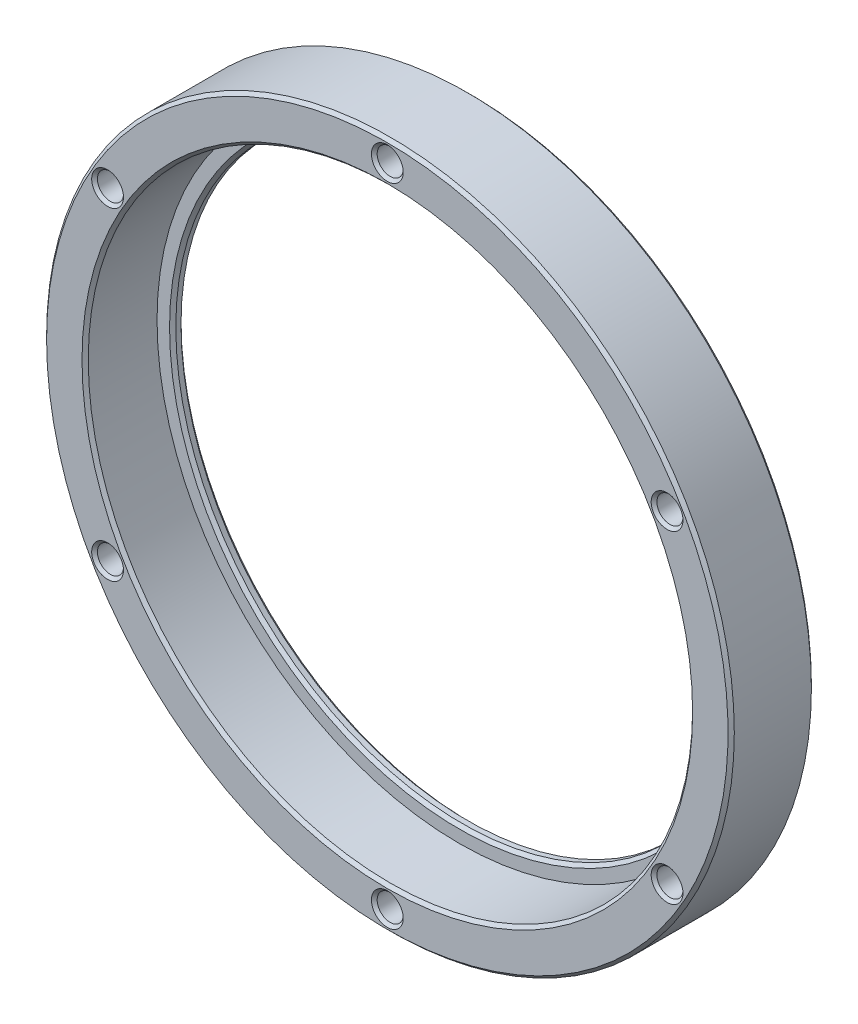
ISO-10303-21;
HEADER;
FILE_DESCRIPTION(('STEP AP214'),'2;1');
FILE_NAME('part.step','',(''),(''),'','','');
FILE_SCHEMA(('AUTOMOTIVE_DESIGN { 1 0 10303 214 1 1 1 1 }'));
ENDSEC;
DATA;
#1=APPLICATION_CONTEXT('core data for automotive mechanical design processes');
#2=APPLICATION_PROTOCOL_DEFINITION('international standard','automotive_design',2000,#1);
#3=PRODUCT_CONTEXT('',#1,'mechanical');
#4=PRODUCT('Part','Part','',(#3));
#5=PRODUCT_RELATED_PRODUCT_CATEGORY('part','',(#4));
#6=PRODUCT_DEFINITION_FORMATION('','',#4);
#7=PRODUCT_DEFINITION_CONTEXT('part definition',#1,'design');
#8=PRODUCT_DEFINITION('design','',#6,#7);
#9=PRODUCT_DEFINITION_SHAPE('','',#8);
#10=(LENGTH_UNIT() NAMED_UNIT(*) SI_UNIT(.MILLI.,.METRE.));
#11=(NAMED_UNIT(*) PLANE_ANGLE_UNIT() SI_UNIT($,.RADIAN.));
#12=(NAMED_UNIT(*) SI_UNIT($,.STERADIAN.) SOLID_ANGLE_UNIT());
#13=UNCERTAINTY_MEASURE_WITH_UNIT(LENGTH_MEASURE(1.E-05),#10,'distance_accuracy_value','');
#14=(GEOMETRIC_REPRESENTATION_CONTEXT(3) GLOBAL_UNCERTAINTY_ASSIGNED_CONTEXT((#13)) GLOBAL_UNIT_ASSIGNED_CONTEXT((#10,
#11,#12)) REPRESENTATION_CONTEXT('',''));
#15=CARTESIAN_POINT('',(0.,0.,0.));
#16=DIRECTION('',(0.,0.,1.));
#17=DIRECTION('',(1.,0.,0.));
#18=AXIS2_PLACEMENT_3D('',#15,#16,#17);
#19=CARTESIAN_POINT('',(33.,0.,8.));
#20=DIRECTION('',(0.,0.,-1.));
#21=DIRECTION('',(-1.,0.,0.));
#22=AXIS2_PLACEMENT_3D('',#19,#20,#21);
#23=PLANE('',#22);
#24=CARTESIAN_POINT('',(0.,0.,8.));
#25=DIRECTION('',(0.,0.,-1.));
#26=DIRECTION('',(-1.,0.,0.));
#27=AXIS2_PLACEMENT_3D('',#24,#25,#26);
#28=CIRCLE('',#27,32.7);
#29=CARTESIAN_POINT('',(-32.7,0.,8.00000000000001));
#30=VERTEX_POINT('',#29);
#31=EDGE_CURVE('E55',#30,#30,#28,.F.);
#32=ORIENTED_EDGE('',*,*,#31,.T.);
#33=EDGE_LOOP('',(#32));
#34=FACE_BOUND('',#33,.T.);
#35=CARTESIAN_POINT('',(0.,0.,8.));
#36=DIRECTION('',(0.,0.,-1.));
#37=DIRECTION('',(-1.,0.,0.));
#38=AXIS2_PLACEMENT_3D('',#35,#36,#37);
#39=CIRCLE('',#38,29.3);
#40=CARTESIAN_POINT('',(-29.3,0.,8.00000000000001));
#41=VERTEX_POINT('',#40);
#42=EDGE_CURVE('E59',#41,#41,#39,.T.);
#43=ORIENTED_EDGE('',*,*,#42,.T.);
#44=EDGE_LOOP('',(#43));
#45=FACE_BOUND('',#44,.T.);
#46=CARTESIAN_POINT('',(-26.8467875173174,15.5000000000003,8.00000000000001));
#47=DIRECTION('',(0.,0.,1.));
#48=DIRECTION('',(0.,-1.,0.));
#49=AXIS2_PLACEMENT_3D('',#46,#47,#48);
#50=CIRCLE('',#49,1.525);
#51=CARTESIAN_POINT('',(-26.8467875173174,13.9750000000003,8.00000000000001));
#52=VERTEX_POINT('',#51);
#53=EDGE_CURVE('E155',#52,#52,#50,.T.);
#54=ORIENTED_EDGE('',*,*,#53,.F.);
#55=EDGE_LOOP('',(#54));
#56=FACE_BOUND('',#55,.T.);
#57=CARTESIAN_POINT('',(-26.8467875173177,-15.4999999999997,8.00000000000001));
#58=DIRECTION('',(0.,0.,1.));
#59=DIRECTION('',(0.,-1.,0.));
#60=AXIS2_PLACEMENT_3D('',#57,#58,#59);
#61=CIRCLE('',#60,1.525);
#62=CARTESIAN_POINT('',(-26.8467875173177,-17.0249999999997,8.00000000000001));
#63=VERTEX_POINT('',#62);
#64=EDGE_CURVE('E143',#63,#63,#61,.T.);
#65=ORIENTED_EDGE('',*,*,#64,.F.);
#66=EDGE_LOOP('',(#65));
#67=FACE_BOUND('',#66,.T.);
#68=CARTESIAN_POINT('',(26.8467875173175,-15.5000000000001,8.));
#69=DIRECTION('',(0.,0.,1.));
#70=DIRECTION('',(0.,-1.,0.));
#71=AXIS2_PLACEMENT_3D('',#68,#69,#70);
#72=CIRCLE('',#71,1.525);
#73=CARTESIAN_POINT('',(26.8467875173175,-17.0250000000001,8.));
#74=VERTEX_POINT('',#73);
#75=EDGE_CURVE('E119',#74,#74,#72,.T.);
#76=ORIENTED_EDGE('',*,*,#75,.F.);
#77=EDGE_LOOP('',(#76));
#78=FACE_BOUND('',#77,.T.);
#79=CARTESIAN_POINT('',(26.8467875173176,15.4999999999999,8.));
#80=DIRECTION('',(0.,0.,1.));
#81=DIRECTION('',(0.,-1.,0.));
#82=AXIS2_PLACEMENT_3D('',#79,#80,#81);
#83=CIRCLE('',#82,1.525);
#84=CARTESIAN_POINT('',(26.8467875173176,13.9749999999999,8.));
#85=VERTEX_POINT('',#84);
#86=EDGE_CURVE('E107',#85,#85,#83,.T.);
#87=ORIENTED_EDGE('',*,*,#86,.F.);
#88=EDGE_LOOP('',(#87));
#89=FACE_BOUND('',#88,.T.);
#90=CARTESIAN_POINT('',(0.,31.,8.));
#91=DIRECTION('',(0.,0.,1.));
#92=DIRECTION('',(1.,0.,0.));
#93=AXIS2_PLACEMENT_3D('',#90,#91,#92);
#94=CIRCLE('',#93,1.525);
#95=CARTESIAN_POINT('',(1.525,31.,8.));
#96=VERTEX_POINT('',#95);
#97=EDGE_CURVE('E95',#96,#96,#94,.T.);
#98=ORIENTED_EDGE('',*,*,#97,.F.);
#99=EDGE_LOOP('',(#98));
#100=FACE_BOUND('',#99,.T.);
#101=CARTESIAN_POINT('',(0.,-31.,8.));
#102=DIRECTION('',(0.,0.,1.));
#103=DIRECTION('',(1.,0.,0.));
#104=AXIS2_PLACEMENT_3D('',#101,#102,#103);
#105=CIRCLE('',#104,1.525);
#106=CARTESIAN_POINT('',(1.525,-31.,8.));
#107=VERTEX_POINT('',#106);
#108=EDGE_CURVE('E131',#107,#107,#105,.T.);
#109=ORIENTED_EDGE('',*,*,#108,.F.);
#110=EDGE_LOOP('',(#109));
#111=FACE_BOUND('',#110,.T.);
#112=ADVANCED_FACE('F47',(#34,#45,#56,#67,#78,#89,#100,#111),#23,.F.);
#113=CARTESIAN_POINT('',(0.,0.,0.));
#114=DIRECTION('',(0.,0.,-1.));
#115=DIRECTION('',(-1.,0.,0.));
#116=AXIS2_PLACEMENT_3D('',#113,#114,#115);
#117=CYLINDRICAL_SURFACE('',#116,27.5000000000054);
#118=CARTESIAN_POINT('',(0.,0.,0.300000000005344));
#119=DIRECTION('',(0.,0.,1.));
#120=DIRECTION('',(1.,0.,0.));
#121=AXIS2_PLACEMENT_3D('',#118,#119,#120);
#122=CIRCLE('',#121,27.5000000000054);
#123=CARTESIAN_POINT('',(27.5000000000054,0.,0.300000000005341));
#124=VERTEX_POINT('',#123);
#125=EDGE_CURVE('E80',#124,#124,#122,.F.);
#126=ORIENTED_EDGE('',*,*,#125,.T.);
#127=EDGE_LOOP('',(#126));
#128=FACE_BOUND('',#127,.T.);
#129=CARTESIAN_POINT('',(0.,0.,0.800000000005345));
#130=DIRECTION('',(0.,0.,-1.));
#131=DIRECTION('',(-1.,0.,0.));
#132=AXIS2_PLACEMENT_3D('',#129,#130,#131);
#133=CIRCLE('',#132,27.5000000000054);
#134=CARTESIAN_POINT('',(-27.5000000000054,0.,0.800000000005348));
#135=VERTEX_POINT('',#134);
#136=EDGE_CURVE('E83',#135,#135,#133,.F.);
#137=ORIENTED_EDGE('',*,*,#136,.T.);
#138=EDGE_LOOP('',(#137));
#139=FACE_BOUND('',#138,.T.);
#140=ADVANCED_FACE('F187',(#128,#139),#117,.F.);
#141=CARTESIAN_POINT('',(27.5000000000107,0.,0.));
#142=DIRECTION('',(0.,0.,1.));
#143=DIRECTION('',(1.,0.,0.));
#144=AXIS2_PLACEMENT_3D('',#141,#142,#143);
#145=PLANE('',#144);
#146=CARTESIAN_POINT('',(0.,0.,0.));
#147=DIRECTION('',(0.,0.,1.));
#148=DIRECTION('',(1.,0.,0.));
#149=AXIS2_PLACEMENT_3D('',#146,#147,#148);
#150=CIRCLE('',#149,27.8000000000107);
#151=CARTESIAN_POINT('',(27.8000000000107,0.,0.));
#152=VERTEX_POINT('',#151);
#153=EDGE_CURVE('E74',#152,#152,#150,.T.);
#154=ORIENTED_EDGE('',*,*,#153,.T.);
#155=EDGE_LOOP('',(#154));
#156=FACE_BOUND('',#155,.T.);
#157=CARTESIAN_POINT('',(0.,0.,0.));
#158=DIRECTION('',(0.,0.,1.));
#159=DIRECTION('',(1.,0.,0.));
#160=AXIS2_PLACEMENT_3D('',#157,#158,#159);
#161=CIRCLE('',#160,32.7);
#162=CARTESIAN_POINT('',(32.7,0.,0.));
#163=VERTEX_POINT('',#162);
#164=EDGE_CURVE('E77',#163,#163,#161,.F.);
#165=ORIENTED_EDGE('',*,*,#164,.T.);
#166=EDGE_LOOP('',(#165));
#167=FACE_BOUND('',#166,.T.);
#168=CARTESIAN_POINT('',(-26.8467875173174,15.5000000000003,0.));
#169=DIRECTION('',(0.,0.,1.));
#170=DIRECTION('',(0.,-1.,0.));
#171=AXIS2_PLACEMENT_3D('',#168,#169,#170);
#172=CIRCLE('',#171,1.525);
#173=CARTESIAN_POINT('',(-26.8467875173174,13.9750000000003,0.));
#174=VERTEX_POINT('',#173);
#175=EDGE_CURVE('E158',#174,#174,#172,.T.);
#176=ORIENTED_EDGE('',*,*,#175,.T.);
#177=EDGE_LOOP('',(#176));
#178=FACE_BOUND('',#177,.T.);
#179=CARTESIAN_POINT('',(-26.8467875173177,-15.4999999999997,0.));
#180=DIRECTION('',(0.,0.,1.));
#181=DIRECTION('',(0.,-1.,0.));
#182=AXIS2_PLACEMENT_3D('',#179,#180,#181);
#183=CIRCLE('',#182,1.525);
#184=CARTESIAN_POINT('',(-26.8467875173177,-17.0249999999997,0.));
#185=VERTEX_POINT('',#184);
#186=EDGE_CURVE('E146',#185,#185,#183,.T.);
#187=ORIENTED_EDGE('',*,*,#186,.T.);
#188=EDGE_LOOP('',(#187));
#189=FACE_BOUND('',#188,.T.);
#190=CARTESIAN_POINT('',(0.,-31.,0.));
#191=DIRECTION('',(0.,0.,1.));
#192=DIRECTION('',(1.,0.,0.));
#193=AXIS2_PLACEMENT_3D('',#190,#191,#192);
#194=CIRCLE('',#193,1.525);
#195=CARTESIAN_POINT('',(1.525,-31.,0.));
#196=VERTEX_POINT('',#195);
#197=EDGE_CURVE('E134',#196,#196,#194,.T.);
#198=ORIENTED_EDGE('',*,*,#197,.T.);
#199=EDGE_LOOP('',(#198));
#200=FACE_BOUND('',#199,.T.);
#201=CARTESIAN_POINT('',(26.8467875173175,-15.5000000000001,0.));
#202=DIRECTION('',(0.,0.,1.));
#203=DIRECTION('',(0.,-1.,0.));
#204=AXIS2_PLACEMENT_3D('',#201,#202,#203);
#205=CIRCLE('',#204,1.525);
#206=CARTESIAN_POINT('',(26.8467875173175,-17.0250000000001,0.));
#207=VERTEX_POINT('',#206);
#208=EDGE_CURVE('E122',#207,#207,#205,.T.);
#209=ORIENTED_EDGE('',*,*,#208,.T.);
#210=EDGE_LOOP('',(#209));
#211=FACE_BOUND('',#210,.T.);
#212=CARTESIAN_POINT('',(26.8467875173176,15.4999999999999,0.));
#213=DIRECTION('',(0.,0.,1.));
#214=DIRECTION('',(0.,-1.,0.));
#215=AXIS2_PLACEMENT_3D('',#212,#213,#214);
#216=CIRCLE('',#215,1.525);
#217=CARTESIAN_POINT('',(26.8467875173176,13.9749999999999,0.));
#218=VERTEX_POINT('',#217);
#219=EDGE_CURVE('E110',#218,#218,#216,.T.);
#220=ORIENTED_EDGE('',*,*,#219,.T.);
#221=EDGE_LOOP('',(#220));
#222=FACE_BOUND('',#221,.T.);
#223=CARTESIAN_POINT('',(0.,31.,0.));
#224=DIRECTION('',(0.,0.,1.));
#225=DIRECTION('',(1.,0.,0.));
#226=AXIS2_PLACEMENT_3D('',#223,#224,#225);
#227=CIRCLE('',#226,1.525);
#228=CARTESIAN_POINT('',(1.525,31.,0.));
#229=VERTEX_POINT('',#228);
#230=EDGE_CURVE('E98',#229,#229,#227,.T.);
#231=ORIENTED_EDGE('',*,*,#230,.T.);
#232=EDGE_LOOP('',(#231));
#233=FACE_BOUND('',#232,.T.);
#234=ADVANCED_FACE('F162',(#156,#167,#178,#189,#200,#211,#222,#233),#145,.F.);
#235=CARTESIAN_POINT('',(0.,0.,0.));
#236=DIRECTION('',(0.,0.,-1.));
#237=DIRECTION('',(-1.,0.,0.));
#238=AXIS2_PLACEMENT_3D('',#235,#236,#237);
#239=CYLINDRICAL_SURFACE('',#238,33.);
#240=CARTESIAN_POINT('',(0.,0.,7.70000000000001));
#241=DIRECTION('',(0.,0.,-1.));
#242=DIRECTION('',(-1.,0.,0.));
#243=AXIS2_PLACEMENT_3D('',#240,#241,#242);
#244=CIRCLE('',#243,33.);
#245=CARTESIAN_POINT('',(-33.,0.,7.70000000000001));
#246=VERTEX_POINT('',#245);
#247=EDGE_CURVE('E63',#246,#246,#244,.T.);
#248=ORIENTED_EDGE('',*,*,#247,.T.);
#249=EDGE_LOOP('',(#248));
#250=FACE_BOUND('',#249,.T.);
#251=CARTESIAN_POINT('',(0.,0.,0.299999999999998));
#252=DIRECTION('',(0.,0.,1.));
#253=DIRECTION('',(1.,0.,0.));
#254=AXIS2_PLACEMENT_3D('',#251,#252,#253);
#255=CIRCLE('',#254,33.);
#256=CARTESIAN_POINT('',(33.,0.,0.299999999999994));
#257=VERTEX_POINT('',#256);
#258=EDGE_CURVE('E68',#257,#257,#255,.T.);
#259=ORIENTED_EDGE('',*,*,#258,.T.);
#260=EDGE_LOOP('',(#259));
#261=FACE_BOUND('',#260,.T.);
#262=ADVANCED_FACE('F264',(#250,#261),#239,.T.);
#263=CARTESIAN_POINT('',(0.,0.,0.));
#264=DIRECTION('',(0.,0.,-1.));
#265=DIRECTION('',(-1.,0.,0.));
#266=AXIS2_PLACEMENT_3D('',#263,#264,#265);
#267=CYLINDRICAL_SURFACE('',#266,29.);
#268=CARTESIAN_POINT('',(0.,0.,7.69999999999999));
#269=DIRECTION('',(0.,0.,-1.));
#270=DIRECTION('',(-1.,0.,0.));
#271=AXIS2_PLACEMENT_3D('',#268,#269,#270);
#272=CIRCLE('',#271,29.);
#273=CARTESIAN_POINT('',(-29.,0.,7.69999999999999));
#274=VERTEX_POINT('',#273);
#275=EDGE_CURVE('E10',#274,#274,#272,.F.);
#276=ORIENTED_EDGE('',*,*,#275,.T.);
#277=EDGE_LOOP('',(#276));
#278=FACE_BOUND('',#277,.T.);
#279=CARTESIAN_POINT('',(0.,0.,1.1));
#280=DIRECTION('',(0.,0.,-1.));
#281=DIRECTION('',(-1.,0.,0.));
#282=AXIS2_PLACEMENT_3D('',#279,#280,#281);
#283=CIRCLE('',#282,29.);
#284=CARTESIAN_POINT('',(-29.,0.,1.10000000000001));
#285=VERTEX_POINT('',#284);
#286=EDGE_CURVE('E86',#285,#285,#283,.T.);
#287=ORIENTED_EDGE('',*,*,#286,.T.);
#288=EDGE_LOOP('',(#287));
#289=FACE_BOUND('',#288,.T.);
#290=ADVANCED_FACE('F261',(#278,#289),#267,.F.);
#291=CARTESIAN_POINT('',(29.,0.,1.1));
#292=DIRECTION('',(0.,0.,-1.));
#293=DIRECTION('',(-1.,0.,0.));
#294=AXIS2_PLACEMENT_3D('',#291,#292,#293);
#295=PLANE('',#294);
#296=CARTESIAN_POINT('',(0.,0.,1.1));
#297=DIRECTION('',(0.,0.,-1.));
#298=DIRECTION('',(-1.,0.,0.));
#299=AXIS2_PLACEMENT_3D('',#296,#297,#298);
#300=CIRCLE('',#299,27.8);
#301=CARTESIAN_POINT('',(-27.8,0.,1.10000000000001));
#302=VERTEX_POINT('',#301);
#303=EDGE_CURVE('E71',#302,#302,#300,.T.);
#304=ORIENTED_EDGE('',*,*,#303,.T.);
#305=EDGE_LOOP('',(#304));
#306=FACE_BOUND('',#305,.T.);
#307=ORIENTED_EDGE('',*,*,#286,.F.);
#308=EDGE_LOOP('',(#307));
#309=FACE_BOUND('',#308,.T.);
#310=ADVANCED_FACE('F257',(#306,#309),#295,.F.);
#311=CARTESIAN_POINT('',(0.,31.,0.275000000000005));
#312=DIRECTION('',(0.,0.,-1.));
#313=DIRECTION('',(-1.,0.,0.));
#314=AXIS2_PLACEMENT_3D('',#311,#312,#313);
#315=CONICAL_SURFACE('',#314,1.25,0.785398163397445);
#316=ORIENTED_EDGE('',*,*,#230,.F.);
#317=EDGE_LOOP('',(#316));
#318=FACE_BOUND('',#317,.T.);
#319=CARTESIAN_POINT('',(0.,31.,0.275000000000005));
#320=DIRECTION('',(0.,0.,1.));
#321=DIRECTION('',(1.,0.,0.));
#322=AXIS2_PLACEMENT_3D('',#319,#320,#321);
#323=CIRCLE('',#322,1.25);
#324=CARTESIAN_POINT('',(1.25,31.,0.275000000000005));
#325=VERTEX_POINT('',#324);
#326=EDGE_CURVE('E89',#325,#325,#323,.T.);
#327=ORIENTED_EDGE('',*,*,#326,.T.);
#328=EDGE_LOOP('',(#327));
#329=FACE_BOUND('',#328,.T.);
#330=ADVANCED_FACE('F253',(#318,#329),#315,.F.);
#331=CARTESIAN_POINT('',(0.,31.,8.));
#332=DIRECTION('',(0.,0.,1.));
#333=DIRECTION('',(1.,0.,0.));
#334=AXIS2_PLACEMENT_3D('',#331,#332,#333);
#335=CYLINDRICAL_SURFACE('',#334,1.25);
#336=ORIENTED_EDGE('',*,*,#326,.F.);
#337=EDGE_LOOP('',(#336));
#338=FACE_BOUND('',#337,.T.);
#339=CARTESIAN_POINT('',(0.,31.,7.725));
#340=DIRECTION('',(0.,0.,1.));
#341=DIRECTION('',(1.,0.,0.));
#342=AXIS2_PLACEMENT_3D('',#339,#340,#341);
#343=CIRCLE('',#342,1.25);
#344=CARTESIAN_POINT('',(1.25,31.,7.725));
#345=VERTEX_POINT('',#344);
#346=EDGE_CURVE('E92',#345,#345,#343,.T.);
#347=ORIENTED_EDGE('',*,*,#346,.T.);
#348=EDGE_LOOP('',(#347));
#349=FACE_BOUND('',#348,.T.);
#350=ADVANCED_FACE('F249',(#338,#349),#335,.F.);
#351=CARTESIAN_POINT('',(0.,31.,8.));
#352=DIRECTION('',(0.,0.,1.));
#353=DIRECTION('',(1.,0.,0.));
#354=AXIS2_PLACEMENT_3D('',#351,#352,#353);
#355=CONICAL_SURFACE('',#354,1.525,0.785398163397448);
#356=ORIENTED_EDGE('',*,*,#346,.F.);
#357=EDGE_LOOP('',(#356));
#358=FACE_BOUND('',#357,.T.);
#359=ORIENTED_EDGE('',*,*,#97,.T.);
#360=EDGE_LOOP('',(#359));
#361=FACE_BOUND('',#360,.T.);
#362=ADVANCED_FACE('F245',(#358,#361),#355,.F.);
#363=CARTESIAN_POINT('',(26.8467875173176,15.4999999999999,0.275000000000002));
#364=DIRECTION('',(0.,0.,-1.));
#365=DIRECTION('',(0.,1.,0.));
#366=AXIS2_PLACEMENT_3D('',#363,#364,#365);
#367=CONICAL_SURFACE('',#366,1.25,0.785398163397447);
#368=ORIENTED_EDGE('',*,*,#219,.F.);
#369=EDGE_LOOP('',(#368));
#370=FACE_BOUND('',#369,.T.);
#371=CARTESIAN_POINT('',(26.8467875173176,15.4999999999999,0.275000000000002));
#372=DIRECTION('',(0.,0.,1.));
#373=DIRECTION('',(0.,-1.,0.));
#374=AXIS2_PLACEMENT_3D('',#371,#372,#373);
#375=CIRCLE('',#374,1.25);
#376=CARTESIAN_POINT('',(26.8467875173176,14.2499999999999,0.275000000000002));
#377=VERTEX_POINT('',#376);
#378=EDGE_CURVE('E101',#377,#377,#375,.T.);
#379=ORIENTED_EDGE('',*,*,#378,.T.);
#380=EDGE_LOOP('',(#379));
#381=FACE_BOUND('',#380,.T.);
#382=ADVANCED_FACE('F241',(#370,#381),#367,.F.);
#383=CARTESIAN_POINT('',(26.8467875173176,15.4999999999999,8.));
#384=DIRECTION('',(0.,0.,1.));
#385=DIRECTION('',(0.,-1.,0.));
#386=AXIS2_PLACEMENT_3D('',#383,#384,#385);
#387=CYLINDRICAL_SURFACE('',#386,1.25);
#388=ORIENTED_EDGE('',*,*,#378,.F.);
#389=EDGE_LOOP('',(#388));
#390=FACE_BOUND('',#389,.T.);
#391=CARTESIAN_POINT('',(26.8467875173176,15.4999999999999,7.725));
#392=DIRECTION('',(0.,0.,1.));
#393=DIRECTION('',(0.,-1.,0.));
#394=AXIS2_PLACEMENT_3D('',#391,#392,#393);
#395=CIRCLE('',#394,1.25);
#396=CARTESIAN_POINT('',(26.8467875173176,14.2499999999999,7.725));
#397=VERTEX_POINT('',#396);
#398=EDGE_CURVE('E104',#397,#397,#395,.T.);
#399=ORIENTED_EDGE('',*,*,#398,.T.);
#400=EDGE_LOOP('',(#399));
#401=FACE_BOUND('',#400,.T.);
#402=ADVANCED_FACE('F237',(#390,#401),#387,.F.);
#403=CARTESIAN_POINT('',(26.8467875173176,15.4999999999999,8.));
#404=DIRECTION('',(0.,0.,1.));
#405=DIRECTION('',(0.,-1.,0.));
#406=AXIS2_PLACEMENT_3D('',#403,#404,#405);
#407=CONICAL_SURFACE('',#406,1.525,0.785398163397448);
#408=ORIENTED_EDGE('',*,*,#398,.F.);
#409=EDGE_LOOP('',(#408));
#410=FACE_BOUND('',#409,.T.);
#411=ORIENTED_EDGE('',*,*,#86,.T.);
#412=EDGE_LOOP('',(#411));
#413=FACE_BOUND('',#412,.T.);
#414=ADVANCED_FACE('F233',(#410,#413),#407,.F.);
#415=CARTESIAN_POINT('',(26.8467875173175,-15.5000000000001,0.275000000000002));
#416=DIRECTION('',(0.,0.,-1.));
#417=DIRECTION('',(0.,1.,0.));
#418=AXIS2_PLACEMENT_3D('',#415,#416,#417);
#419=CONICAL_SURFACE('',#418,1.25,0.785398163397447);
#420=ORIENTED_EDGE('',*,*,#208,.F.);
#421=EDGE_LOOP('',(#420));
#422=FACE_BOUND('',#421,.T.);
#423=CARTESIAN_POINT('',(26.8467875173175,-15.5000000000001,0.275000000000002));
#424=DIRECTION('',(0.,0.,1.));
#425=DIRECTION('',(0.,-1.,0.));
#426=AXIS2_PLACEMENT_3D('',#423,#424,#425);
#427=CIRCLE('',#426,1.25);
#428=CARTESIAN_POINT('',(26.8467875173175,-16.7500000000001,0.275000000000002));
#429=VERTEX_POINT('',#428);
#430=EDGE_CURVE('E113',#429,#429,#427,.T.);
#431=ORIENTED_EDGE('',*,*,#430,.T.);
#432=EDGE_LOOP('',(#431));
#433=FACE_BOUND('',#432,.T.);
#434=ADVANCED_FACE('F229',(#422,#433),#419,.F.);
#435=CARTESIAN_POINT('',(26.8467875173175,-15.5000000000001,8.));
#436=DIRECTION('',(0.,0.,1.));
#437=DIRECTION('',(0.,-1.,0.));
#438=AXIS2_PLACEMENT_3D('',#435,#436,#437);
#439=CYLINDRICAL_SURFACE('',#438,1.25);
#440=ORIENTED_EDGE('',*,*,#430,.F.);
#441=EDGE_LOOP('',(#440));
#442=FACE_BOUND('',#441,.T.);
#443=CARTESIAN_POINT('',(26.8467875173175,-15.5000000000001,7.725));
#444=DIRECTION('',(0.,0.,1.));
#445=DIRECTION('',(0.,-1.,0.));
#446=AXIS2_PLACEMENT_3D('',#443,#444,#445);
#447=CIRCLE('',#446,1.25);
#448=CARTESIAN_POINT('',(26.8467875173175,-16.7500000000001,7.725));
#449=VERTEX_POINT('',#448);
#450=EDGE_CURVE('E116',#449,#449,#447,.T.);
#451=ORIENTED_EDGE('',*,*,#450,.T.);
#452=EDGE_LOOP('',(#451));
#453=FACE_BOUND('',#452,.T.);
#454=ADVANCED_FACE('F225',(#442,#453),#439,.F.);
#455=CARTESIAN_POINT('',(26.8467875173175,-15.5000000000001,8.));
#456=DIRECTION('',(0.,0.,1.));
#457=DIRECTION('',(0.,-1.,0.));
#458=AXIS2_PLACEMENT_3D('',#455,#456,#457);
#459=CONICAL_SURFACE('',#458,1.525,0.785398163397448);
#460=ORIENTED_EDGE('',*,*,#450,.F.);
#461=EDGE_LOOP('',(#460));
#462=FACE_BOUND('',#461,.T.);
#463=ORIENTED_EDGE('',*,*,#75,.T.);
#464=EDGE_LOOP('',(#463));
#465=FACE_BOUND('',#464,.T.);
#466=ADVANCED_FACE('F221',(#462,#465),#459,.F.);
#467=CARTESIAN_POINT('',(0.,-31.,0.275000000000005));
#468=DIRECTION('',(0.,0.,-1.));
#469=DIRECTION('',(-1.,0.,0.));
#470=AXIS2_PLACEMENT_3D('',#467,#468,#469);
#471=CONICAL_SURFACE('',#470,1.25,0.785398163397445);
#472=ORIENTED_EDGE('',*,*,#197,.F.);
#473=EDGE_LOOP('',(#472));
#474=FACE_BOUND('',#473,.T.);
#475=CARTESIAN_POINT('',(0.,-31.,0.275000000000005));
#476=DIRECTION('',(0.,0.,1.));
#477=DIRECTION('',(1.,0.,0.));
#478=AXIS2_PLACEMENT_3D('',#475,#476,#477);
#479=CIRCLE('',#478,1.25);
#480=CARTESIAN_POINT('',(1.25,-31.,0.275000000000005));
#481=VERTEX_POINT('',#480);
#482=EDGE_CURVE('E125',#481,#481,#479,.T.);
#483=ORIENTED_EDGE('',*,*,#482,.T.);
#484=EDGE_LOOP('',(#483));
#485=FACE_BOUND('',#484,.T.);
#486=ADVANCED_FACE('F213',(#474,#485),#471,.F.);
#487=CARTESIAN_POINT('',(0.,-31.,8.));
#488=DIRECTION('',(0.,0.,1.));
#489=DIRECTION('',(1.,0.,0.));
#490=AXIS2_PLACEMENT_3D('',#487,#488,#489);
#491=CYLINDRICAL_SURFACE('',#490,1.25);
#492=ORIENTED_EDGE('',*,*,#482,.F.);
#493=EDGE_LOOP('',(#492));
#494=FACE_BOUND('',#493,.T.);
#495=CARTESIAN_POINT('',(0.,-31.,7.725));
#496=DIRECTION('',(0.,0.,1.));
#497=DIRECTION('',(1.,0.,0.));
#498=AXIS2_PLACEMENT_3D('',#495,#496,#497);
#499=CIRCLE('',#498,1.25);
#500=CARTESIAN_POINT('',(1.25,-31.,7.725));
#501=VERTEX_POINT('',#500);
#502=EDGE_CURVE('E128',#501,#501,#499,.T.);
#503=ORIENTED_EDGE('',*,*,#502,.T.);
#504=EDGE_LOOP('',(#503));
#505=FACE_BOUND('',#504,.T.);
#506=ADVANCED_FACE('F202',(#494,#505),#491,.F.);
#507=CARTESIAN_POINT('',(0.,-31.,8.));
#508=DIRECTION('',(0.,0.,1.));
#509=DIRECTION('',(1.,0.,0.));
#510=AXIS2_PLACEMENT_3D('',#507,#508,#509);
#511=CONICAL_SURFACE('',#510,1.525,0.785398163397448);
#512=ORIENTED_EDGE('',*,*,#502,.F.);
#513=EDGE_LOOP('',(#512));
#514=FACE_BOUND('',#513,.T.);
#515=ORIENTED_EDGE('',*,*,#108,.T.);
#516=EDGE_LOOP('',(#515));
#517=FACE_BOUND('',#516,.T.);
#518=ADVANCED_FACE('F199',(#514,#517),#511,.F.);
#519=CARTESIAN_POINT('',(-26.8467875173177,-15.4999999999997,0.275000000000009));
#520=DIRECTION('',(0.,0.,-1.));
#521=DIRECTION('',(0.,1.,0.));
#522=AXIS2_PLACEMENT_3D('',#519,#520,#521);
#523=CONICAL_SURFACE('',#522,1.25,0.785398163397447);
#524=ORIENTED_EDGE('',*,*,#186,.F.);
#525=EDGE_LOOP('',(#524));
#526=FACE_BOUND('',#525,.T.);
#527=CARTESIAN_POINT('',(-26.8467875173177,-15.4999999999997,0.275000000000009));
#528=DIRECTION('',(0.,0.,1.));
#529=DIRECTION('',(0.,-1.,0.));
#530=AXIS2_PLACEMENT_3D('',#527,#528,#529);
#531=CIRCLE('',#530,1.25);
#532=CARTESIAN_POINT('',(-26.8467875173177,-16.7499999999997,0.275000000000009));
#533=VERTEX_POINT('',#532);
#534=EDGE_CURVE('E137',#533,#533,#531,.T.);
#535=ORIENTED_EDGE('',*,*,#534,.T.);
#536=EDGE_LOOP('',(#535));
#537=FACE_BOUND('',#536,.T.);
#538=ADVANCED_FACE('F201',(#526,#537),#523,.F.);
#539=CARTESIAN_POINT('',(-26.8467875173177,-15.4999999999997,8.00000000000001));
#540=DIRECTION('',(0.,0.,1.));
#541=DIRECTION('',(0.,-1.,0.));
#542=AXIS2_PLACEMENT_3D('',#539,#540,#541);
#543=CYLINDRICAL_SURFACE('',#542,1.25);
#544=ORIENTED_EDGE('',*,*,#534,.F.);
#545=EDGE_LOOP('',(#544));
#546=FACE_BOUND('',#545,.T.);
#547=CARTESIAN_POINT('',(-26.8467875173177,-15.4999999999997,7.72500000000001));
#548=DIRECTION('',(0.,0.,1.));
#549=DIRECTION('',(0.,-1.,0.));
#550=AXIS2_PLACEMENT_3D('',#547,#548,#549);
#551=CIRCLE('',#550,1.25);
#552=CARTESIAN_POINT('',(-26.8467875173177,-16.7499999999997,7.72500000000001));
#553=VERTEX_POINT('',#552);
#554=EDGE_CURVE('E140',#553,#553,#551,.T.);
#555=ORIENTED_EDGE('',*,*,#554,.T.);
#556=EDGE_LOOP('',(#555));
#557=FACE_BOUND('',#556,.T.);
#558=ADVANCED_FACE('F209',(#546,#557),#543,.F.);
#559=CARTESIAN_POINT('',(-26.8467875173177,-15.4999999999997,8.00000000000001));
#560=DIRECTION('',(0.,0.,1.));
#561=DIRECTION('',(0.,-1.,0.));
#562=AXIS2_PLACEMENT_3D('',#559,#560,#561);
#563=CONICAL_SURFACE('',#562,1.525,0.785398163397448);
#564=ORIENTED_EDGE('',*,*,#554,.F.);
#565=EDGE_LOOP('',(#564));
#566=FACE_BOUND('',#565,.T.);
#567=ORIENTED_EDGE('',*,*,#64,.T.);
#568=EDGE_LOOP('',(#567));
#569=FACE_BOUND('',#568,.T.);
#570=ADVANCED_FACE('F169',(#566,#569),#563,.F.);
#571=CARTESIAN_POINT('',(-26.8467875173174,15.5000000000003,0.275000000000009));
#572=DIRECTION('',(0.,0.,-1.));
#573=DIRECTION('',(0.,1.,0.));
#574=AXIS2_PLACEMENT_3D('',#571,#572,#573);
#575=CONICAL_SURFACE('',#574,1.25,0.785398163397447);
#576=ORIENTED_EDGE('',*,*,#175,.F.);
#577=EDGE_LOOP('',(#576));
#578=FACE_BOUND('',#577,.T.);
#579=CARTESIAN_POINT('',(-26.8467875173174,15.5000000000003,0.275000000000009));
#580=DIRECTION('',(0.,0.,1.));
#581=DIRECTION('',(0.,-1.,0.));
#582=AXIS2_PLACEMENT_3D('',#579,#580,#581);
#583=CIRCLE('',#582,1.25);
#584=CARTESIAN_POINT('',(-26.8467875173174,14.2500000000003,0.275000000000009));
#585=VERTEX_POINT('',#584);
#586=EDGE_CURVE('E149',#585,#585,#583,.T.);
#587=ORIENTED_EDGE('',*,*,#586,.T.);
#588=EDGE_LOOP('',(#587));
#589=FACE_BOUND('',#588,.T.);
#590=ADVANCED_FACE('F165',(#578,#589),#575,.F.);
#591=CARTESIAN_POINT('',(-26.8467875173174,15.5000000000003,8.00000000000001));
#592=DIRECTION('',(0.,0.,1.));
#593=DIRECTION('',(0.,-1.,0.));
#594=AXIS2_PLACEMENT_3D('',#591,#592,#593);
#595=CYLINDRICAL_SURFACE('',#594,1.25);
#596=ORIENTED_EDGE('',*,*,#586,.F.);
#597=EDGE_LOOP('',(#596));
#598=FACE_BOUND('',#597,.T.);
#599=CARTESIAN_POINT('',(-26.8467875173174,15.5000000000003,7.72500000000001));
#600=DIRECTION('',(0.,0.,1.));
#601=DIRECTION('',(0.,-1.,0.));
#602=AXIS2_PLACEMENT_3D('',#599,#600,#601);
#603=CIRCLE('',#602,1.25);
#604=CARTESIAN_POINT('',(-26.8467875173174,14.2500000000003,7.72500000000001));
#605=VERTEX_POINT('',#604);
#606=EDGE_CURVE('E152',#605,#605,#603,.T.);
#607=ORIENTED_EDGE('',*,*,#606,.T.);
#608=EDGE_LOOP('',(#607));
#609=FACE_BOUND('',#608,.T.);
#610=ADVANCED_FACE('F168',(#598,#609),#595,.F.);
#611=CARTESIAN_POINT('',(-26.8467875173174,15.5000000000003,8.00000000000001));
#612=DIRECTION('',(0.,0.,1.));
#613=DIRECTION('',(0.,-1.,0.));
#614=AXIS2_PLACEMENT_3D('',#611,#612,#613);
#615=CONICAL_SURFACE('',#614,1.525,0.785398163397448);
#616=ORIENTED_EDGE('',*,*,#606,.F.);
#617=EDGE_LOOP('',(#616));
#618=FACE_BOUND('',#617,.T.);
#619=ORIENTED_EDGE('',*,*,#53,.T.);
#620=EDGE_LOOP('',(#619));
#621=FACE_BOUND('',#620,.T.);
#622=ADVANCED_FACE('F175',(#618,#621),#615,.F.);
#623=CARTESIAN_POINT('',(0.,0.,0.300000000005344));
#624=DIRECTION('',(0.,0.,-1.));
#625=DIRECTION('',(-1.,0.,0.));
#626=AXIS2_PLACEMENT_3D('',#623,#624,#625);
#627=CONICAL_SURFACE('',#626,27.5000000000054,0.785398163397448);
#628=ORIENTED_EDGE('',*,*,#153,.F.);
#629=EDGE_LOOP('',(#628));
#630=FACE_BOUND('',#629,.T.);
#631=ORIENTED_EDGE('',*,*,#125,.F.);
#632=EDGE_LOOP('',(#631));
#633=FACE_BOUND('',#632,.T.);
#634=ADVANCED_FACE('F181',(#630,#633),#627,.F.);
#635=CARTESIAN_POINT('',(0.,0.,1.1));
#636=DIRECTION('',(0.,0.,1.));
#637=DIRECTION('',(1.,0.,0.));
#638=AXIS2_PLACEMENT_3D('',#635,#636,#637);
#639=CONICAL_SURFACE('',#638,27.8,0.78539816339746);
#640=ORIENTED_EDGE('',*,*,#136,.F.);
#641=EDGE_LOOP('',(#640));
#642=FACE_BOUND('',#641,.T.);
#643=ORIENTED_EDGE('',*,*,#303,.F.);
#644=EDGE_LOOP('',(#643));
#645=FACE_BOUND('',#644,.T.);
#646=ADVANCED_FACE('F281',(#642,#645),#639,.F.);
#647=CARTESIAN_POINT('',(0.,0.,7.70000000000001));
#648=DIRECTION('',(0.,0.,-1.));
#649=DIRECTION('',(-1.,0.,0.));
#650=AXIS2_PLACEMENT_3D('',#647,#648,#649);
#651=CONICAL_SURFACE('',#650,33.,0.78539816339746);
#652=ORIENTED_EDGE('',*,*,#31,.F.);
#653=EDGE_LOOP('',(#652));
#654=FACE_BOUND('',#653,.T.);
#655=ORIENTED_EDGE('',*,*,#247,.F.);
#656=EDGE_LOOP('',(#655));
#657=FACE_BOUND('',#656,.T.);
#658=ADVANCED_FACE('F288',(#654,#657),#651,.T.);
#659=CARTESIAN_POINT('',(0.,0.,0.));
#660=DIRECTION('',(0.,0.,1.));
#661=DIRECTION('',(1.,0.,0.));
#662=AXIS2_PLACEMENT_3D('',#659,#660,#661);
#663=CONICAL_SURFACE('',#662,32.7,0.785398163397437);
#664=ORIENTED_EDGE('',*,*,#258,.F.);
#665=EDGE_LOOP('',(#664));
#666=FACE_BOUND('',#665,.T.);
#667=ORIENTED_EDGE('',*,*,#164,.F.);
#668=EDGE_LOOP('',(#667));
#669=FACE_BOUND('',#668,.T.);
#670=ADVANCED_FACE('F294',(#666,#669),#663,.T.);
#671=CARTESIAN_POINT('',(0.,0.,8.));
#672=DIRECTION('',(0.,0.,1.));
#673=DIRECTION('',(1.,0.,0.));
#674=AXIS2_PLACEMENT_3D('',#671,#672,#673);
#675=CONICAL_SURFACE('',#674,29.3,0.785398163397454);
#676=ORIENTED_EDGE('',*,*,#275,.F.);
#677=EDGE_LOOP('',(#676));
#678=FACE_BOUND('',#677,.T.);
#679=ORIENTED_EDGE('',*,*,#42,.F.);
#680=EDGE_LOOP('',(#679));
#681=FACE_BOUND('',#680,.T.);
#682=ADVANCED_FACE('F50',(#678,#681),#675,.F.);
#683=CLOSED_SHELL('',(#112,#140,#234,#262,#290,#310,#330,#350,#362,#382,#402,#414,#434,#454,
#466,#486,#506,#518,#538,#558,#570,#590,#610,#622,#634,#646,#658,#670,#682));
#684=MANIFOLD_SOLID_BREP('B2',#683);
#685=ADVANCED_BREP_SHAPE_REPRESENTATION('',(#18,#684),#14);
#686=SHAPE_DEFINITION_REPRESENTATION(#9,#685);
ENDSEC;
END-ISO-10303-21;
